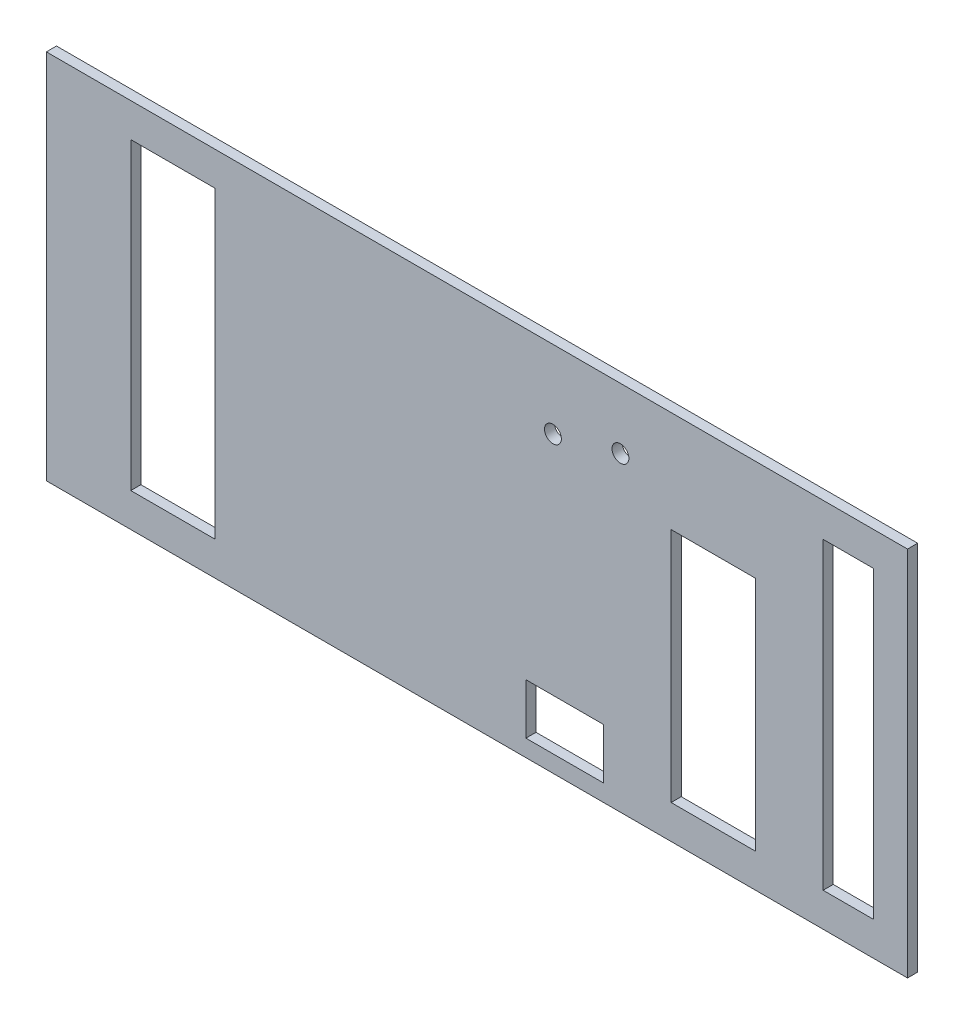
ISO-10303-21;
HEADER;
FILE_DESCRIPTION(('STEP AP214'),'2;1');
FILE_NAME('part.step','',(''),(''),'','','');
FILE_SCHEMA(('AUTOMOTIVE_DESIGN { 1 0 10303 214 1 1 1 1 }'));
ENDSEC;
DATA;
#1=APPLICATION_CONTEXT('core data for automotive mechanical design processes');
#2=APPLICATION_PROTOCOL_DEFINITION('international standard','automotive_design',2000,#1);
#3=PRODUCT_CONTEXT('',#1,'mechanical');
#4=PRODUCT('Part','Part','',(#3));
#5=PRODUCT_RELATED_PRODUCT_CATEGORY('part','',(#4));
#6=PRODUCT_DEFINITION_FORMATION('','',#4);
#7=PRODUCT_DEFINITION_CONTEXT('part definition',#1,'design');
#8=PRODUCT_DEFINITION('design','',#6,#7);
#9=PRODUCT_DEFINITION_SHAPE('','',#8);
#10=(LENGTH_UNIT() NAMED_UNIT(*) SI_UNIT(.MILLI.,.METRE.));
#11=(NAMED_UNIT(*) PLANE_ANGLE_UNIT() SI_UNIT($,.RADIAN.));
#12=(NAMED_UNIT(*) SI_UNIT($,.STERADIAN.) SOLID_ANGLE_UNIT());
#13=UNCERTAINTY_MEASURE_WITH_UNIT(LENGTH_MEASURE(1.E-05),#10,'distance_accuracy_value','');
#14=(GEOMETRIC_REPRESENTATION_CONTEXT(3) GLOBAL_UNCERTAINTY_ASSIGNED_CONTEXT((#13)) GLOBAL_UNIT_ASSIGNED_CONTEXT((#10,
#11,#12)) REPRESENTATION_CONTEXT('',''));
#15=CARTESIAN_POINT('',(0.,0.,0.));
#16=DIRECTION('',(0.,0.,1.));
#17=DIRECTION('',(1.,0.,0.));
#18=AXIS2_PLACEMENT_3D('',#15,#16,#17);
#19=CARTESIAN_POINT('',(0.,0.,3.));
#20=DIRECTION('',(0.,0.,1.));
#21=DIRECTION('',(1.,0.,0.));
#22=AXIS2_PLACEMENT_3D('',#19,#20,#21);
#23=PLANE('',#22);
#24=CARTESIAN_POINT('',(29.2739273927393,24.7392739273927,3.));
#25=DIRECTION('',(0.,0.,1.));
#26=DIRECTION('',(1.,0.,0.));
#27=AXIS2_PLACEMENT_3D('',#24,#25,#26);
#28=CIRCLE('',#27,2.5);
#29=CARTESIAN_POINT('',(31.7739273927393,24.7392739273927,3.));
#30=VERTEX_POINT('',#29);
#31=EDGE_CURVE('E200',#30,#30,#28,.T.);
#32=ORIENTED_EDGE('',*,*,#31,.F.);
#33=EDGE_LOOP('',(#32));
#34=FACE_BOUND('',#33,.T.);
#35=DIRECTION('',(0.,-1.,0.));
#36=VECTOR('',#35,1.);
#37=CARTESIAN_POINT('',(-120.726072607261,47.7392739273927,3.));
#38=LINE('',#37,#36);
#39=CARTESIAN_POINT('',(-120.726072607261,47.7392739273927,3.));
#40=VERTEX_POINT('',#39);
#41=CARTESIAN_POINT('',(-120.726072607261,-62.2607260726073,3.));
#42=VERTEX_POINT('',#41);
#43=EDGE_CURVE('E303',#40,#42,#38,.T.);
#44=ORIENTED_EDGE('',*,*,#43,.T.);
#45=DIRECTION('',(1.,0.,0.));
#46=VECTOR('',#45,1.);
#47=CARTESIAN_POINT('',(-120.726072607261,-62.2607260726073,3.));
#48=LINE('',#47,#46);
#49=CARTESIAN_POINT('',(134.273927392739,-62.2607260726073,3.));
#50=VERTEX_POINT('',#49);
#51=EDGE_CURVE('E306',#42,#50,#48,.T.);
#52=ORIENTED_EDGE('',*,*,#51,.T.);
#53=DIRECTION('',(0.,1.,0.));
#54=VECTOR('',#53,1.);
#55=CARTESIAN_POINT('',(134.273927392739,47.7392739273927,3.));
#56=LINE('',#55,#54);
#57=CARTESIAN_POINT('',(134.273927392739,47.7392739273927,3.));
#58=VERTEX_POINT('',#57);
#59=EDGE_CURVE('E309',#50,#58,#56,.T.);
#60=ORIENTED_EDGE('',*,*,#59,.T.);
#61=DIRECTION('',(-1.,0.,0.));
#62=VECTOR('',#61,1.);
#63=CARTESIAN_POINT('',(-120.726072607261,47.7392739273927,3.));
#64=LINE('',#63,#62);
#65=EDGE_CURVE('E311',#58,#40,#64,.T.);
#66=ORIENTED_EDGE('',*,*,#65,.T.);
#67=EDGE_LOOP('',(#44,#52,#60,#66));
#68=FACE_BOUND('',#67,.T.);
#69=DIRECTION('',(1.,0.,0.));
#70=VECTOR('',#69,1.);
#71=CARTESIAN_POINT('',(109.273927392739,-52.2607260726073,3.));
#72=LINE('',#71,#70);
#73=CARTESIAN_POINT('',(109.273927392739,-52.2607260726073,3.));
#74=VERTEX_POINT('',#73);
#75=CARTESIAN_POINT('',(124.273927392739,-52.2607260726073,3.));
#76=VERTEX_POINT('',#75);
#77=EDGE_CURVE('E274',#74,#76,#72,.T.);
#78=ORIENTED_EDGE('',*,*,#77,.F.);
#79=DIRECTION('',(0.,-1.,0.));
#80=VECTOR('',#79,1.);
#81=CARTESIAN_POINT('',(109.273927392739,37.7392739273927,3.));
#82=LINE('',#81,#80);
#83=CARTESIAN_POINT('',(109.273927392739,37.7392739273927,3.));
#84=VERTEX_POINT('',#83);
#85=EDGE_CURVE('E272',#84,#74,#82,.T.);
#86=ORIENTED_EDGE('',*,*,#85,.F.);
#87=DIRECTION('',(-1.,0.,0.));
#88=VECTOR('',#87,1.);
#89=CARTESIAN_POINT('',(109.273927392739,37.7392739273927,3.));
#90=LINE('',#89,#88);
#91=CARTESIAN_POINT('',(124.273927392739,37.7392739273927,3.));
#92=VERTEX_POINT('',#91);
#93=EDGE_CURVE('E280',#92,#84,#90,.T.);
#94=ORIENTED_EDGE('',*,*,#93,.F.);
#95=DIRECTION('',(0.,1.,0.));
#96=VECTOR('',#95,1.);
#97=CARTESIAN_POINT('',(124.273927392739,37.7392739273927,3.));
#98=LINE('',#97,#96);
#99=EDGE_CURVE('E277',#76,#92,#98,.T.);
#100=ORIENTED_EDGE('',*,*,#99,.F.);
#101=EDGE_LOOP('',(#78,#86,#94,#100));
#102=FACE_BOUND('',#101,.T.);
#103=DIRECTION('',(1.,0.,0.));
#104=VECTOR('',#103,1.);
#105=CARTESIAN_POINT('',(-95.7260726072607,-52.2607260726073,3.));
#106=LINE('',#105,#104);
#107=CARTESIAN_POINT('',(-95.7260726072607,-52.2607260726073,3.));
#108=VERTEX_POINT('',#107);
#109=CARTESIAN_POINT('',(-70.7260726072607,-52.2607260726073,3.));
#110=VERTEX_POINT('',#109);
#111=EDGE_CURVE('E243',#108,#110,#106,.T.);
#112=ORIENTED_EDGE('',*,*,#111,.F.);
#113=DIRECTION('',(0.,-1.,0.));
#114=VECTOR('',#113,1.);
#115=CARTESIAN_POINT('',(-95.7260726072607,37.7392739273927,3.));
#116=LINE('',#115,#114);
#117=CARTESIAN_POINT('',(-95.7260726072607,37.7392739273927,3.));
#118=VERTEX_POINT('',#117);
#119=EDGE_CURVE('E241',#118,#108,#116,.T.);
#120=ORIENTED_EDGE('',*,*,#119,.F.);
#121=DIRECTION('',(-1.,0.,0.));
#122=VECTOR('',#121,1.);
#123=CARTESIAN_POINT('',(-95.7260726072607,37.7392739273927,3.));
#124=LINE('',#123,#122);
#125=CARTESIAN_POINT('',(-70.7260726072607,37.7392739273927,3.));
#126=VERTEX_POINT('',#125);
#127=EDGE_CURVE('E249',#126,#118,#124,.T.);
#128=ORIENTED_EDGE('',*,*,#127,.F.);
#129=DIRECTION('',(0.,1.,0.));
#130=VECTOR('',#129,1.);
#131=CARTESIAN_POINT('',(-70.7260726072607,37.7392739273927,3.));
#132=LINE('',#131,#130);
#133=EDGE_CURVE('E246',#110,#126,#132,.T.);
#134=ORIENTED_EDGE('',*,*,#133,.F.);
#135=EDGE_LOOP('',(#112,#120,#128,#134));
#136=FACE_BOUND('',#135,.T.);
#137=DIRECTION('',(1.,0.,0.));
#138=VECTOR('',#137,1.);
#139=CARTESIAN_POINT('',(21.2739273927393,-57.2607260726073,3.));
#140=LINE('',#139,#138);
#141=CARTESIAN_POINT('',(21.2739273927393,-57.2607260726073,3.));
#142=VERTEX_POINT('',#141);
#143=CARTESIAN_POINT('',(44.2739273927393,-57.2607260726073,3.));
#144=VERTEX_POINT('',#143);
#145=EDGE_CURVE('E212',#142,#144,#140,.T.);
#146=ORIENTED_EDGE('',*,*,#145,.F.);
#147=DIRECTION('',(0.,-1.,0.));
#148=VECTOR('',#147,1.);
#149=CARTESIAN_POINT('',(21.2739273927393,-42.2607260726073,3.));
#150=LINE('',#149,#148);
#151=CARTESIAN_POINT('',(21.2739273927393,-42.2607260726073,3.));
#152=VERTEX_POINT('',#151);
#153=EDGE_CURVE('E210',#152,#142,#150,.T.);
#154=ORIENTED_EDGE('',*,*,#153,.F.);
#155=DIRECTION('',(-1.,0.,0.));
#156=VECTOR('',#155,1.);
#157=CARTESIAN_POINT('',(21.2739273927393,-42.2607260726073,3.));
#158=LINE('',#157,#156);
#159=CARTESIAN_POINT('',(44.2739273927393,-42.2607260726073,3.));
#160=VERTEX_POINT('',#159);
#161=EDGE_CURVE('E218',#160,#152,#158,.T.);
#162=ORIENTED_EDGE('',*,*,#161,.F.);
#163=DIRECTION('',(0.,1.,0.));
#164=VECTOR('',#163,1.);
#165=CARTESIAN_POINT('',(44.2739273927393,-42.2607260726073,3.));
#166=LINE('',#165,#164);
#167=EDGE_CURVE('E215',#144,#160,#166,.T.);
#168=ORIENTED_EDGE('',*,*,#167,.F.);
#169=EDGE_LOOP('',(#146,#154,#162,#168));
#170=FACE_BOUND('',#169,.T.);
#171=DIRECTION('',(1.,0.,0.));
#172=VECTOR('',#171,1.);
#173=CARTESIAN_POINT('',(64.2739273927393,-52.2607260726073,3.));
#174=LINE('',#173,#172);
#175=CARTESIAN_POINT('',(64.2739273927393,-52.2607260726073,3.));
#176=VERTEX_POINT('',#175);
#177=CARTESIAN_POINT('',(89.2739273927393,-52.2607260726073,3.));
#178=VERTEX_POINT('',#177);
#179=EDGE_CURVE('E179',#176,#178,#174,.T.);
#180=ORIENTED_EDGE('',*,*,#179,.F.);
#181=DIRECTION('',(0.,-1.,0.));
#182=VECTOR('',#181,1.);
#183=CARTESIAN_POINT('',(64.2739273927393,17.7392739273927,3.));
#184=LINE('',#183,#182);
#185=CARTESIAN_POINT('',(64.2739273927393,17.7392739273927,3.));
#186=VERTEX_POINT('',#185);
#187=EDGE_CURVE('E171',#186,#176,#184,.T.);
#188=ORIENTED_EDGE('',*,*,#187,.F.);
#189=DIRECTION('',(-1.,0.,0.));
#190=VECTOR('',#189,1.);
#191=CARTESIAN_POINT('',(64.2739273927393,17.7392739273927,3.));
#192=LINE('',#191,#190);
#193=CARTESIAN_POINT('',(89.2739273927393,17.7392739273927,3.));
#194=VERTEX_POINT('',#193);
#195=EDGE_CURVE('E194',#194,#186,#192,.T.);
#196=ORIENTED_EDGE('',*,*,#195,.F.);
#197=DIRECTION('',(0.,1.,0.));
#198=VECTOR('',#197,1.);
#199=CARTESIAN_POINT('',(89.2739273927393,17.7392739273927,3.));
#200=LINE('',#199,#198);
#201=EDGE_CURVE('E192',#178,#194,#200,.T.);
#202=ORIENTED_EDGE('',*,*,#201,.F.);
#203=EDGE_LOOP('',(#180,#188,#196,#202));
#204=FACE_BOUND('',#203,.T.);
#205=CARTESIAN_POINT('',(49.2739273927393,29.7392739273927,3.));
#206=DIRECTION('',(0.,0.,1.));
#207=DIRECTION('',(1.,0.,0.));
#208=AXIS2_PLACEMENT_3D('',#205,#206,#207);
#209=CIRCLE('',#208,2.5);
#210=CARTESIAN_POINT('',(51.7739273927393,29.7392739273927,3.));
#211=VERTEX_POINT('',#210);
#212=EDGE_CURVE('E545',#211,#211,#209,.T.);
#213=ORIENTED_EDGE('',*,*,#212,.F.);
#214=EDGE_LOOP('',(#213));
#215=FACE_BOUND('',#214,.T.);
#216=ADVANCED_FACE('F34',(#34,#68,#102,#136,#170,#204,#215),#23,.T.);
#217=CARTESIAN_POINT('',(0.,0.,0.));
#218=DIRECTION('',(0.,0.,1.));
#219=DIRECTION('',(1.,0.,0.));
#220=AXIS2_PLACEMENT_3D('',#217,#218,#219);
#221=PLANE('',#220);
#222=DIRECTION('',(0.,-1.,0.));
#223=VECTOR('',#222,1.);
#224=CARTESIAN_POINT('',(21.2739273927393,-42.2607260726073,0.));
#225=LINE('',#224,#223);
#226=CARTESIAN_POINT('',(21.2739273927393,-42.2607260726073,0.));
#227=VERTEX_POINT('',#226);
#228=CARTESIAN_POINT('',(21.2739273927393,-57.2607260726073,0.));
#229=VERTEX_POINT('',#228);
#230=EDGE_CURVE('E187',#227,#229,#225,.T.);
#231=ORIENTED_EDGE('',*,*,#230,.T.);
#232=DIRECTION('',(1.,0.,0.));
#233=VECTOR('',#232,1.);
#234=CARTESIAN_POINT('',(21.2739273927393,-57.2607260726073,0.));
#235=LINE('',#234,#233);
#236=CARTESIAN_POINT('',(44.2739273927393,-57.2607260726073,0.));
#237=VERTEX_POINT('',#236);
#238=EDGE_CURVE('E223',#229,#237,#235,.T.);
#239=ORIENTED_EDGE('',*,*,#238,.T.);
#240=DIRECTION('',(0.,1.,0.));
#241=VECTOR('',#240,1.);
#242=CARTESIAN_POINT('',(44.2739273927393,-42.2607260726073,0.));
#243=LINE('',#242,#241);
#244=CARTESIAN_POINT('',(44.2739273927393,-42.2607260726073,0.));
#245=VERTEX_POINT('',#244);
#246=EDGE_CURVE('E226',#237,#245,#243,.T.);
#247=ORIENTED_EDGE('',*,*,#246,.T.);
#248=DIRECTION('',(-1.,0.,0.));
#249=VECTOR('',#248,1.);
#250=CARTESIAN_POINT('',(21.2739273927393,-42.2607260726073,0.));
#251=LINE('',#250,#249);
#252=EDGE_CURVE('E213',#245,#227,#251,.T.);
#253=ORIENTED_EDGE('',*,*,#252,.T.);
#254=EDGE_LOOP('',(#231,#239,#247,#253));
#255=FACE_BOUND('',#254,.T.);
#256=DIRECTION('',(0.,-1.,0.));
#257=VECTOR('',#256,1.);
#258=CARTESIAN_POINT('',(109.273927392739,37.7392739273927,0.));
#259=LINE('',#258,#257);
#260=CARTESIAN_POINT('',(109.273927392739,37.7392739273927,0.));
#261=VERTEX_POINT('',#260);
#262=CARTESIAN_POINT('',(109.273927392739,-52.2607260726073,0.));
#263=VERTEX_POINT('',#262);
#264=EDGE_CURVE('E271',#261,#263,#259,.T.);
#265=ORIENTED_EDGE('',*,*,#264,.T.);
#266=DIRECTION('',(1.,0.,0.));
#267=VECTOR('',#266,1.);
#268=CARTESIAN_POINT('',(109.273927392739,-52.2607260726073,0.));
#269=LINE('',#268,#267);
#270=CARTESIAN_POINT('',(124.273927392739,-52.2607260726073,0.));
#271=VERTEX_POINT('',#270);
#272=EDGE_CURVE('E285',#263,#271,#269,.T.);
#273=ORIENTED_EDGE('',*,*,#272,.T.);
#274=DIRECTION('',(0.,1.,0.));
#275=VECTOR('',#274,1.);
#276=CARTESIAN_POINT('',(124.273927392739,37.7392739273927,0.));
#277=LINE('',#276,#275);
#278=CARTESIAN_POINT('',(124.273927392739,37.7392739273927,0.));
#279=VERTEX_POINT('',#278);
#280=EDGE_CURVE('E288',#271,#279,#277,.T.);
#281=ORIENTED_EDGE('',*,*,#280,.T.);
#282=DIRECTION('',(-1.,0.,0.));
#283=VECTOR('',#282,1.);
#284=CARTESIAN_POINT('',(109.273927392739,37.7392739273927,0.));
#285=LINE('',#284,#283);
#286=EDGE_CURVE('E275',#279,#261,#285,.T.);
#287=ORIENTED_EDGE('',*,*,#286,.T.);
#288=EDGE_LOOP('',(#265,#273,#281,#287));
#289=FACE_BOUND('',#288,.T.);
#290=DIRECTION('',(0.,-1.,0.));
#291=VECTOR('',#290,1.);
#292=CARTESIAN_POINT('',(-120.726072607261,47.7392739273927,0.));
#293=LINE('',#292,#291);
#294=CARTESIAN_POINT('',(-120.726072607261,47.7392739273927,0.));
#295=VERTEX_POINT('',#294);
#296=CARTESIAN_POINT('',(-120.726072607261,-62.2607260726073,0.));
#297=VERTEX_POINT('',#296);
#298=EDGE_CURVE('E302',#295,#297,#293,.T.);
#299=ORIENTED_EDGE('',*,*,#298,.F.);
#300=DIRECTION('',(-1.,0.,0.));
#301=VECTOR('',#300,1.);
#302=CARTESIAN_POINT('',(-120.726072607261,47.7392739273927,0.));
#303=LINE('',#302,#301);
#304=CARTESIAN_POINT('',(134.273927392739,47.7392739273927,0.));
#305=VERTEX_POINT('',#304);
#306=EDGE_CURVE('E307',#305,#295,#303,.T.);
#307=ORIENTED_EDGE('',*,*,#306,.F.);
#308=DIRECTION('',(0.,1.,0.));
#309=VECTOR('',#308,1.);
#310=CARTESIAN_POINT('',(134.273927392739,47.7392739273927,0.));
#311=LINE('',#310,#309);
#312=CARTESIAN_POINT('',(134.273927392739,-62.2607260726073,0.));
#313=VERTEX_POINT('',#312);
#314=EDGE_CURVE('E318',#313,#305,#311,.T.);
#315=ORIENTED_EDGE('',*,*,#314,.F.);
#316=DIRECTION('',(1.,0.,0.));
#317=VECTOR('',#316,1.);
#318=CARTESIAN_POINT('',(-120.726072607261,-62.2607260726073,0.));
#319=LINE('',#318,#317);
#320=EDGE_CURVE('E316',#297,#313,#319,.T.);
#321=ORIENTED_EDGE('',*,*,#320,.F.);
#322=EDGE_LOOP('',(#299,#307,#315,#321));
#323=FACE_BOUND('',#322,.T.);
#324=DIRECTION('',(0.,-1.,0.));
#325=VECTOR('',#324,1.);
#326=CARTESIAN_POINT('',(-95.7260726072607,37.7392739273927,0.));
#327=LINE('',#326,#325);
#328=CARTESIAN_POINT('',(-95.7260726072607,37.7392739273927,0.));
#329=VERTEX_POINT('',#328);
#330=CARTESIAN_POINT('',(-95.7260726072607,-52.2607260726073,0.));
#331=VERTEX_POINT('',#330);
#332=EDGE_CURVE('E240',#329,#331,#327,.T.);
#333=ORIENTED_EDGE('',*,*,#332,.T.);
#334=DIRECTION('',(1.,0.,0.));
#335=VECTOR('',#334,1.);
#336=CARTESIAN_POINT('',(-95.7260726072607,-52.2607260726073,0.));
#337=LINE('',#336,#335);
#338=CARTESIAN_POINT('',(-70.7260726072607,-52.2607260726073,0.));
#339=VERTEX_POINT('',#338);
#340=EDGE_CURVE('E254',#331,#339,#337,.T.);
#341=ORIENTED_EDGE('',*,*,#340,.T.);
#342=DIRECTION('',(0.,1.,0.));
#343=VECTOR('',#342,1.);
#344=CARTESIAN_POINT('',(-70.7260726072607,37.7392739273927,0.));
#345=LINE('',#344,#343);
#346=CARTESIAN_POINT('',(-70.7260726072607,37.7392739273927,0.));
#347=VERTEX_POINT('',#346);
#348=EDGE_CURVE('E257',#339,#347,#345,.T.);
#349=ORIENTED_EDGE('',*,*,#348,.T.);
#350=DIRECTION('',(-1.,0.,0.));
#351=VECTOR('',#350,1.);
#352=CARTESIAN_POINT('',(-95.7260726072607,37.7392739273927,0.));
#353=LINE('',#352,#351);
#354=EDGE_CURVE('E244',#347,#329,#353,.T.);
#355=ORIENTED_EDGE('',*,*,#354,.T.);
#356=EDGE_LOOP('',(#333,#341,#349,#355));
#357=FACE_BOUND('',#356,.T.);
#358=DIRECTION('',(0.,-1.,0.));
#359=VECTOR('',#358,1.);
#360=CARTESIAN_POINT('',(64.2739273927393,17.7392739273927,0.));
#361=LINE('',#360,#359);
#362=CARTESIAN_POINT('',(64.2739273927393,17.7392739273927,0.));
#363=VERTEX_POINT('',#362);
#364=CARTESIAN_POINT('',(64.2739273927393,-52.2607260726073,0.));
#365=VERTEX_POINT('',#364);
#366=EDGE_CURVE('E57',#363,#365,#361,.T.);
#367=ORIENTED_EDGE('',*,*,#366,.T.);
#368=DIRECTION('',(1.,0.,0.));
#369=VECTOR('',#368,1.);
#370=CARTESIAN_POINT('',(64.2739273927393,-52.2607260726073,0.));
#371=LINE('',#370,#369);
#372=CARTESIAN_POINT('',(89.2739273927393,-52.2607260726073,0.));
#373=VERTEX_POINT('',#372);
#374=EDGE_CURVE('E186',#365,#373,#371,.T.);
#375=ORIENTED_EDGE('',*,*,#374,.T.);
#376=DIRECTION('',(0.,1.,0.));
#377=VECTOR('',#376,1.);
#378=CARTESIAN_POINT('',(89.2739273927393,17.7392739273927,0.));
#379=LINE('',#378,#377);
#380=CARTESIAN_POINT('',(89.2739273927393,17.7392739273927,0.));
#381=VERTEX_POINT('',#380);
#382=EDGE_CURVE('E202',#373,#381,#379,.T.);
#383=ORIENTED_EDGE('',*,*,#382,.T.);
#384=DIRECTION('',(-1.,0.,0.));
#385=VECTOR('',#384,1.);
#386=CARTESIAN_POINT('',(64.2739273927393,17.7392739273927,0.));
#387=LINE('',#386,#385);
#388=EDGE_CURVE('E180',#381,#363,#387,.T.);
#389=ORIENTED_EDGE('',*,*,#388,.T.);
#390=EDGE_LOOP('',(#367,#375,#383,#389));
#391=FACE_BOUND('',#390,.T.);
#392=CARTESIAN_POINT('',(29.2739273927393,24.7392739273927,0.));
#393=DIRECTION('',(0.,0.,1.));
#394=DIRECTION('',(1.,0.,0.));
#395=AXIS2_PLACEMENT_3D('',#392,#393,#394);
#396=CIRCLE('',#395,2.5);
#397=CARTESIAN_POINT('',(31.7739273927393,24.7392739273927,0.));
#398=VERTEX_POINT('',#397);
#399=EDGE_CURVE('E551',#398,#398,#396,.T.);
#400=ORIENTED_EDGE('',*,*,#399,.T.);
#401=EDGE_LOOP('',(#400));
#402=FACE_BOUND('',#401,.T.);
#403=CARTESIAN_POINT('',(49.2739273927393,29.7392739273927,0.));
#404=DIRECTION('',(0.,0.,1.));
#405=DIRECTION('',(1.,0.,0.));
#406=AXIS2_PLACEMENT_3D('',#403,#404,#405);
#407=CIRCLE('',#406,2.5);
#408=CARTESIAN_POINT('',(51.7739273927393,29.7392739273927,0.));
#409=VERTEX_POINT('',#408);
#410=EDGE_CURVE('E548',#409,#409,#407,.T.);
#411=ORIENTED_EDGE('',*,*,#410,.T.);
#412=EDGE_LOOP('',(#411));
#413=FACE_BOUND('',#412,.T.);
#414=ADVANCED_FACE('F336',(#255,#289,#323,#357,#391,#402,#413),#221,.F.);
#415=CARTESIAN_POINT('',(-120.726072607261,47.7392739273927,3.));
#416=DIRECTION('',(1.,0.,0.));
#417=DIRECTION('',(0.,0.,-1.));
#418=AXIS2_PLACEMENT_3D('',#415,#416,#417);
#419=PLANE('',#418);
#420=ORIENTED_EDGE('',*,*,#298,.T.);
#421=DIRECTION('',(0.,0.,-1.));
#422=VECTOR('',#421,1.);
#423=CARTESIAN_POINT('',(-120.726072607261,-62.2607260726073,3.));
#424=LINE('',#423,#422);
#425=EDGE_CURVE('E11',#42,#297,#424,.T.);
#426=ORIENTED_EDGE('',*,*,#425,.F.);
#427=ORIENTED_EDGE('',*,*,#43,.F.);
#428=DIRECTION('',(0.,0.,-1.));
#429=VECTOR('',#428,1.);
#430=CARTESIAN_POINT('',(-120.726072607261,47.7392739273927,3.));
#431=LINE('',#430,#429);
#432=EDGE_CURVE('E313',#40,#295,#431,.T.);
#433=ORIENTED_EDGE('',*,*,#432,.T.);
#434=EDGE_LOOP('',(#420,#426,#427,#433));
#435=FACE_BOUND('',#434,.T.);
#436=ADVANCED_FACE('F36',(#435),#419,.F.);
#437=CARTESIAN_POINT('',(-120.726072607261,-62.2607260726073,3.));
#438=DIRECTION('',(0.,1.,0.));
#439=DIRECTION('',(-1.,0.,0.));
#440=AXIS2_PLACEMENT_3D('',#437,#438,#439);
#441=PLANE('',#440);
#442=ORIENTED_EDGE('',*,*,#320,.T.);
#443=DIRECTION('',(0.,0.,-1.));
#444=VECTOR('',#443,1.);
#445=CARTESIAN_POINT('',(134.273927392739,-62.2607260726073,3.));
#446=LINE('',#445,#444);
#447=EDGE_CURVE('E42',#50,#313,#446,.T.);
#448=ORIENTED_EDGE('',*,*,#447,.F.);
#449=ORIENTED_EDGE('',*,*,#51,.F.);
#450=ORIENTED_EDGE('',*,*,#425,.T.);
#451=EDGE_LOOP('',(#442,#448,#449,#450));
#452=FACE_BOUND('',#451,.T.);
#453=ADVANCED_FACE('F347',(#452),#441,.F.);
#454=CARTESIAN_POINT('',(134.273927392739,47.7392739273927,3.));
#455=DIRECTION('',(-1.,0.,0.));
#456=DIRECTION('',(0.,-1.,0.));
#457=AXIS2_PLACEMENT_3D('',#454,#455,#456);
#458=PLANE('',#457);
#459=ORIENTED_EDGE('',*,*,#314,.T.);
#460=DIRECTION('',(0.,0.,-1.));
#461=VECTOR('',#460,1.);
#462=CARTESIAN_POINT('',(134.273927392739,47.7392739273927,3.));
#463=LINE('',#462,#461);
#464=EDGE_CURVE('E323',#58,#305,#463,.T.);
#465=ORIENTED_EDGE('',*,*,#464,.F.);
#466=ORIENTED_EDGE('',*,*,#59,.F.);
#467=ORIENTED_EDGE('',*,*,#447,.T.);
#468=EDGE_LOOP('',(#459,#465,#466,#467));
#469=FACE_BOUND('',#468,.T.);
#470=ADVANCED_FACE('F330',(#469),#458,.F.);
#471=CARTESIAN_POINT('',(-120.726072607261,47.7392739273927,3.));
#472=DIRECTION('',(0.,-1.,0.));
#473=DIRECTION('',(0.,0.,-1.));
#474=AXIS2_PLACEMENT_3D('',#471,#472,#473);
#475=PLANE('',#474);
#476=ORIENTED_EDGE('',*,*,#306,.T.);
#477=ORIENTED_EDGE('',*,*,#432,.F.);
#478=ORIENTED_EDGE('',*,*,#65,.F.);
#479=ORIENTED_EDGE('',*,*,#464,.T.);
#480=EDGE_LOOP('',(#476,#477,#478,#479));
#481=FACE_BOUND('',#480,.T.);
#482=ADVANCED_FACE('F340',(#481),#475,.F.);
#483=CARTESIAN_POINT('',(109.273927392739,37.7392739273927,3.));
#484=DIRECTION('',(1.,0.,0.));
#485=DIRECTION('',(0.,1.,0.));
#486=AXIS2_PLACEMENT_3D('',#483,#484,#485);
#487=PLANE('',#486);
#488=ORIENTED_EDGE('',*,*,#264,.F.);
#489=DIRECTION('',(0.,0.,-1.));
#490=VECTOR('',#489,1.);
#491=CARTESIAN_POINT('',(109.273927392739,37.7392739273927,3.));
#492=LINE('',#491,#490);
#493=EDGE_CURVE('E282',#84,#261,#492,.T.);
#494=ORIENTED_EDGE('',*,*,#493,.F.);
#495=ORIENTED_EDGE('',*,*,#85,.T.);
#496=DIRECTION('',(0.,0.,-1.));
#497=VECTOR('',#496,1.);
#498=CARTESIAN_POINT('',(109.273927392739,-52.2607260726073,3.));
#499=LINE('',#498,#497);
#500=EDGE_CURVE('E299',#74,#263,#499,.T.);
#501=ORIENTED_EDGE('',*,*,#500,.T.);
#502=EDGE_LOOP('',(#488,#494,#495,#501));
#503=FACE_BOUND('',#502,.T.);
#504=ADVANCED_FACE('F364',(#503),#487,.T.);
#505=CARTESIAN_POINT('',(109.273927392739,-52.2607260726073,3.));
#506=DIRECTION('',(0.,1.,0.));
#507=DIRECTION('',(0.,0.,1.));
#508=AXIS2_PLACEMENT_3D('',#505,#506,#507);
#509=PLANE('',#508);
#510=ORIENTED_EDGE('',*,*,#272,.F.);
#511=ORIENTED_EDGE('',*,*,#500,.F.);
#512=ORIENTED_EDGE('',*,*,#77,.T.);
#513=DIRECTION('',(0.,0.,-1.));
#514=VECTOR('',#513,1.);
#515=CARTESIAN_POINT('',(124.273927392739,-52.2607260726073,3.));
#516=LINE('',#515,#514);
#517=EDGE_CURVE('E297',#76,#271,#516,.T.);
#518=ORIENTED_EDGE('',*,*,#517,.T.);
#519=EDGE_LOOP('',(#510,#511,#512,#518));
#520=FACE_BOUND('',#519,.T.);
#521=ADVANCED_FACE('F371',(#520),#509,.T.);
#522=CARTESIAN_POINT('',(124.273927392739,37.7392739273927,3.));
#523=DIRECTION('',(-1.,0.,0.));
#524=DIRECTION('',(0.,0.,1.));
#525=AXIS2_PLACEMENT_3D('',#522,#523,#524);
#526=PLANE('',#525);
#527=ORIENTED_EDGE('',*,*,#280,.F.);
#528=ORIENTED_EDGE('',*,*,#517,.F.);
#529=ORIENTED_EDGE('',*,*,#99,.T.);
#530=DIRECTION('',(0.,0.,-1.));
#531=VECTOR('',#530,1.);
#532=CARTESIAN_POINT('',(124.273927392739,37.7392739273927,3.));
#533=LINE('',#532,#531);
#534=EDGE_CURVE('E295',#92,#279,#533,.T.);
#535=ORIENTED_EDGE('',*,*,#534,.T.);
#536=EDGE_LOOP('',(#527,#528,#529,#535));
#537=FACE_BOUND('',#536,.T.);
#538=ADVANCED_FACE('F376',(#537),#526,.T.);
#539=CARTESIAN_POINT('',(109.273927392739,37.7392739273927,3.));
#540=DIRECTION('',(0.,-1.,0.));
#541=DIRECTION('',(0.,0.,-1.));
#542=AXIS2_PLACEMENT_3D('',#539,#540,#541);
#543=PLANE('',#542);
#544=ORIENTED_EDGE('',*,*,#286,.F.);
#545=ORIENTED_EDGE('',*,*,#534,.F.);
#546=ORIENTED_EDGE('',*,*,#93,.T.);
#547=ORIENTED_EDGE('',*,*,#493,.T.);
#548=EDGE_LOOP('',(#544,#545,#546,#547));
#549=FACE_BOUND('',#548,.T.);
#550=ADVANCED_FACE('F384',(#549),#543,.T.);
#551=CARTESIAN_POINT('',(-95.7260726072607,37.7392739273927,3.));
#552=DIRECTION('',(1.,0.,0.));
#553=DIRECTION('',(0.,1.,0.));
#554=AXIS2_PLACEMENT_3D('',#551,#552,#553);
#555=PLANE('',#554);
#556=ORIENTED_EDGE('',*,*,#332,.F.);
#557=DIRECTION('',(0.,0.,-1.));
#558=VECTOR('',#557,1.);
#559=CARTESIAN_POINT('',(-95.7260726072607,37.7392739273927,3.));
#560=LINE('',#559,#558);
#561=EDGE_CURVE('E251',#118,#329,#560,.T.);
#562=ORIENTED_EDGE('',*,*,#561,.F.);
#563=ORIENTED_EDGE('',*,*,#119,.T.);
#564=DIRECTION('',(0.,0.,-1.));
#565=VECTOR('',#564,1.);
#566=CARTESIAN_POINT('',(-95.7260726072607,-52.2607260726073,3.));
#567=LINE('',#566,#565);
#568=EDGE_CURVE('E268',#108,#331,#567,.T.);
#569=ORIENTED_EDGE('',*,*,#568,.T.);
#570=EDGE_LOOP('',(#556,#562,#563,#569));
#571=FACE_BOUND('',#570,.T.);
#572=ADVANCED_FACE('F438',(#571),#555,.T.);
#573=CARTESIAN_POINT('',(-95.7260726072607,-52.2607260726073,3.));
#574=DIRECTION('',(0.,1.,0.));
#575=DIRECTION('',(0.,0.,1.));
#576=AXIS2_PLACEMENT_3D('',#573,#574,#575);
#577=PLANE('',#576);
#578=ORIENTED_EDGE('',*,*,#340,.F.);
#579=ORIENTED_EDGE('',*,*,#568,.F.);
#580=ORIENTED_EDGE('',*,*,#111,.T.);
#581=DIRECTION('',(0.,0.,-1.));
#582=VECTOR('',#581,1.);
#583=CARTESIAN_POINT('',(-70.7260726072607,-52.2607260726073,3.));
#584=LINE('',#583,#582);
#585=EDGE_CURVE('E266',#110,#339,#584,.T.);
#586=ORIENTED_EDGE('',*,*,#585,.T.);
#587=EDGE_LOOP('',(#578,#579,#580,#586));
#588=FACE_BOUND('',#587,.T.);
#589=ADVANCED_FACE('F434',(#588),#577,.T.);
#590=CARTESIAN_POINT('',(-70.7260726072607,37.7392739273927,3.));
#591=DIRECTION('',(-1.,0.,0.));
#592=DIRECTION('',(0.,-1.,0.));
#593=AXIS2_PLACEMENT_3D('',#590,#591,#592);
#594=PLANE('',#593);
#595=ORIENTED_EDGE('',*,*,#348,.F.);
#596=ORIENTED_EDGE('',*,*,#585,.F.);
#597=ORIENTED_EDGE('',*,*,#133,.T.);
#598=DIRECTION('',(0.,0.,-1.));
#599=VECTOR('',#598,1.);
#600=CARTESIAN_POINT('',(-70.7260726072607,37.7392739273927,3.));
#601=LINE('',#600,#599);
#602=EDGE_CURVE('E264',#126,#347,#601,.T.);
#603=ORIENTED_EDGE('',*,*,#602,.T.);
#604=EDGE_LOOP('',(#595,#596,#597,#603));
#605=FACE_BOUND('',#604,.T.);
#606=ADVANCED_FACE('F430',(#605),#594,.T.);
#607=CARTESIAN_POINT('',(-95.7260726072607,37.7392739273927,3.));
#608=DIRECTION('',(0.,-1.,0.));
#609=DIRECTION('',(0.,0.,-1.));
#610=AXIS2_PLACEMENT_3D('',#607,#608,#609);
#611=PLANE('',#610);
#612=ORIENTED_EDGE('',*,*,#354,.F.);
#613=ORIENTED_EDGE('',*,*,#602,.F.);
#614=ORIENTED_EDGE('',*,*,#127,.T.);
#615=ORIENTED_EDGE('',*,*,#561,.T.);
#616=EDGE_LOOP('',(#612,#613,#614,#615));
#617=FACE_BOUND('',#616,.T.);
#618=ADVANCED_FACE('F427',(#617),#611,.T.);
#619=CARTESIAN_POINT('',(21.2739273927393,-42.2607260726073,3.));
#620=DIRECTION('',(1.,0.,0.));
#621=DIRECTION('',(0.,0.,-1.));
#622=AXIS2_PLACEMENT_3D('',#619,#620,#621);
#623=PLANE('',#622);
#624=ORIENTED_EDGE('',*,*,#230,.F.);
#625=DIRECTION('',(0.,0.,-1.));
#626=VECTOR('',#625,1.);
#627=CARTESIAN_POINT('',(21.2739273927393,-42.2607260726073,3.));
#628=LINE('',#627,#626);
#629=EDGE_CURVE('E220',#152,#227,#628,.T.);
#630=ORIENTED_EDGE('',*,*,#629,.F.);
#631=ORIENTED_EDGE('',*,*,#153,.T.);
#632=DIRECTION('',(0.,0.,-1.));
#633=VECTOR('',#632,1.);
#634=CARTESIAN_POINT('',(21.2739273927393,-57.2607260726073,3.));
#635=LINE('',#634,#633);
#636=EDGE_CURVE('E237',#142,#229,#635,.T.);
#637=ORIENTED_EDGE('',*,*,#636,.T.);
#638=EDGE_LOOP('',(#624,#630,#631,#637));
#639=FACE_BOUND('',#638,.T.);
#640=ADVANCED_FACE('F409',(#639),#623,.T.);
#641=CARTESIAN_POINT('',(21.2739273927393,-57.2607260726073,3.));
#642=DIRECTION('',(0.,1.,0.));
#643=DIRECTION('',(0.,0.,1.));
#644=AXIS2_PLACEMENT_3D('',#641,#642,#643);
#645=PLANE('',#644);
#646=ORIENTED_EDGE('',*,*,#238,.F.);
#647=ORIENTED_EDGE('',*,*,#636,.F.);
#648=ORIENTED_EDGE('',*,*,#145,.T.);
#649=DIRECTION('',(0.,0.,-1.));
#650=VECTOR('',#649,1.);
#651=CARTESIAN_POINT('',(44.2739273927393,-57.2607260726073,3.));
#652=LINE('',#651,#650);
#653=EDGE_CURVE('E235',#144,#237,#652,.T.);
#654=ORIENTED_EDGE('',*,*,#653,.T.);
#655=EDGE_LOOP('',(#646,#647,#648,#654));
#656=FACE_BOUND('',#655,.T.);
#657=ADVANCED_FACE('F403',(#656),#645,.T.);
#658=CARTESIAN_POINT('',(44.2739273927393,-42.2607260726073,3.));
#659=DIRECTION('',(-1.,0.,0.));
#660=DIRECTION('',(0.,-1.,0.));
#661=AXIS2_PLACEMENT_3D('',#658,#659,#660);
#662=PLANE('',#661);
#663=ORIENTED_EDGE('',*,*,#246,.F.);
#664=ORIENTED_EDGE('',*,*,#653,.F.);
#665=ORIENTED_EDGE('',*,*,#167,.T.);
#666=DIRECTION('',(0.,0.,-1.));
#667=VECTOR('',#666,1.);
#668=CARTESIAN_POINT('',(44.2739273927393,-42.2607260726073,3.));
#669=LINE('',#668,#667);
#670=EDGE_CURVE('E233',#160,#245,#669,.T.);
#671=ORIENTED_EDGE('',*,*,#670,.T.);
#672=EDGE_LOOP('',(#663,#664,#665,#671));
#673=FACE_BOUND('',#672,.T.);
#674=ADVANCED_FACE('F406',(#673),#662,.T.);
#675=CARTESIAN_POINT('',(21.2739273927393,-42.2607260726073,3.));
#676=DIRECTION('',(0.,-1.,0.));
#677=DIRECTION('',(0.,0.,-1.));
#678=AXIS2_PLACEMENT_3D('',#675,#676,#677);
#679=PLANE('',#678);
#680=ORIENTED_EDGE('',*,*,#252,.F.);
#681=ORIENTED_EDGE('',*,*,#670,.F.);
#682=ORIENTED_EDGE('',*,*,#161,.T.);
#683=ORIENTED_EDGE('',*,*,#629,.T.);
#684=EDGE_LOOP('',(#680,#681,#682,#683));
#685=FACE_BOUND('',#684,.T.);
#686=ADVANCED_FACE('F412',(#685),#679,.T.);
#687=CARTESIAN_POINT('',(64.2739273927393,17.7392739273927,3.));
#688=DIRECTION('',(1.,0.,0.));
#689=DIRECTION('',(0.,1.,0.));
#690=AXIS2_PLACEMENT_3D('',#687,#688,#689);
#691=PLANE('',#690);
#692=ORIENTED_EDGE('',*,*,#366,.F.);
#693=DIRECTION('',(0.,0.,-1.));
#694=VECTOR('',#693,1.);
#695=CARTESIAN_POINT('',(64.2739273927393,17.7392739273927,3.));
#696=LINE('',#695,#694);
#697=EDGE_CURVE('E175',#186,#363,#696,.T.);
#698=ORIENTED_EDGE('',*,*,#697,.F.);
#699=ORIENTED_EDGE('',*,*,#187,.T.);
#700=DIRECTION('',(0.,0.,-1.));
#701=VECTOR('',#700,1.);
#702=CARTESIAN_POINT('',(64.2739273927393,-52.2607260726073,3.));
#703=LINE('',#702,#701);
#704=EDGE_CURVE('E174',#176,#365,#703,.T.);
#705=ORIENTED_EDGE('',*,*,#704,.T.);
#706=EDGE_LOOP('',(#692,#698,#699,#705));
#707=FACE_BOUND('',#706,.T.);
#708=ADVANCED_FACE('F173',(#707),#691,.T.);
#709=CARTESIAN_POINT('',(64.2739273927393,-52.2607260726073,3.));
#710=DIRECTION('',(0.,1.,0.));
#711=DIRECTION('',(0.,0.,1.));
#712=AXIS2_PLACEMENT_3D('',#709,#710,#711);
#713=PLANE('',#712);
#714=ORIENTED_EDGE('',*,*,#374,.F.);
#715=ORIENTED_EDGE('',*,*,#704,.F.);
#716=ORIENTED_EDGE('',*,*,#179,.T.);
#717=DIRECTION('',(0.,0.,-1.));
#718=VECTOR('',#717,1.);
#719=CARTESIAN_POINT('',(89.2739273927393,-52.2607260726073,3.));
#720=LINE('',#719,#718);
#721=EDGE_CURVE('E188',#178,#373,#720,.T.);
#722=ORIENTED_EDGE('',*,*,#721,.T.);
#723=EDGE_LOOP('',(#714,#715,#716,#722));
#724=FACE_BOUND('',#723,.T.);
#725=ADVANCED_FACE('F183',(#724),#713,.T.);
#726=CARTESIAN_POINT('',(89.2739273927393,17.7392739273927,3.));
#727=DIRECTION('',(-1.,0.,0.));
#728=DIRECTION('',(0.,-1.,0.));
#729=AXIS2_PLACEMENT_3D('',#726,#727,#728);
#730=PLANE('',#729);
#731=ORIENTED_EDGE('',*,*,#382,.F.);
#732=ORIENTED_EDGE('',*,*,#721,.F.);
#733=ORIENTED_EDGE('',*,*,#201,.T.);
#734=DIRECTION('',(0.,0.,-1.));
#735=VECTOR('',#734,1.);
#736=CARTESIAN_POINT('',(89.2739273927393,17.7392739273927,3.));
#737=LINE('',#736,#735);
#738=EDGE_CURVE('E49',#194,#381,#737,.T.);
#739=ORIENTED_EDGE('',*,*,#738,.T.);
#740=EDGE_LOOP('',(#731,#732,#733,#739));
#741=FACE_BOUND('',#740,.T.);
#742=ADVANCED_FACE('F501',(#741),#730,.T.);
#743=CARTESIAN_POINT('',(64.2739273927393,17.7392739273927,3.));
#744=DIRECTION('',(0.,-1.,0.));
#745=DIRECTION('',(0.,0.,-1.));
#746=AXIS2_PLACEMENT_3D('',#743,#744,#745);
#747=PLANE('',#746);
#748=ORIENTED_EDGE('',*,*,#388,.F.);
#749=ORIENTED_EDGE('',*,*,#738,.F.);
#750=ORIENTED_EDGE('',*,*,#195,.T.);
#751=ORIENTED_EDGE('',*,*,#697,.T.);
#752=EDGE_LOOP('',(#748,#749,#750,#751));
#753=FACE_BOUND('',#752,.T.);
#754=ADVANCED_FACE('F509',(#753),#747,.T.);
#755=CARTESIAN_POINT('',(29.2739273927393,24.7392739273927,3.));
#756=DIRECTION('',(0.,0.,-1.));
#757=DIRECTION('',(-1.,0.,0.));
#758=AXIS2_PLACEMENT_3D('',#755,#756,#757);
#759=CYLINDRICAL_SURFACE('',#758,2.5);
#760=ORIENTED_EDGE('',*,*,#31,.T.);
#761=EDGE_LOOP('',(#760));
#762=FACE_BOUND('',#761,.T.);
#763=ORIENTED_EDGE('',*,*,#399,.F.);
#764=EDGE_LOOP('',(#763));
#765=FACE_BOUND('',#764,.T.);
#766=ADVANCED_FACE('F519',(#762,#765),#759,.F.);
#767=CARTESIAN_POINT('',(49.2739273927393,29.7392739273927,3.));
#768=DIRECTION('',(0.,0.,-1.));
#769=DIRECTION('',(-1.,0.,0.));
#770=AXIS2_PLACEMENT_3D('',#767,#768,#769);
#771=CYLINDRICAL_SURFACE('',#770,2.5);
#772=ORIENTED_EDGE('',*,*,#212,.T.);
#773=EDGE_LOOP('',(#772));
#774=FACE_BOUND('',#773,.T.);
#775=ORIENTED_EDGE('',*,*,#410,.F.);
#776=EDGE_LOOP('',(#775));
#777=FACE_BOUND('',#776,.T.);
#778=ADVANCED_FACE('F528',(#774,#777),#771,.F.);
#779=CLOSED_SHELL('',(#216,#414,#436,#453,#470,#482,#504,#521,#538,#550,#572,#589,#606,#618,
#640,#657,#674,#686,#708,#725,#742,#754,#766,#778));
#780=MANIFOLD_SOLID_BREP('B2',#779);
#781=ADVANCED_BREP_SHAPE_REPRESENTATION('',(#18,#780),#14);
#782=SHAPE_DEFINITION_REPRESENTATION(#9,#781);
ENDSEC;
END-ISO-10303-21;
